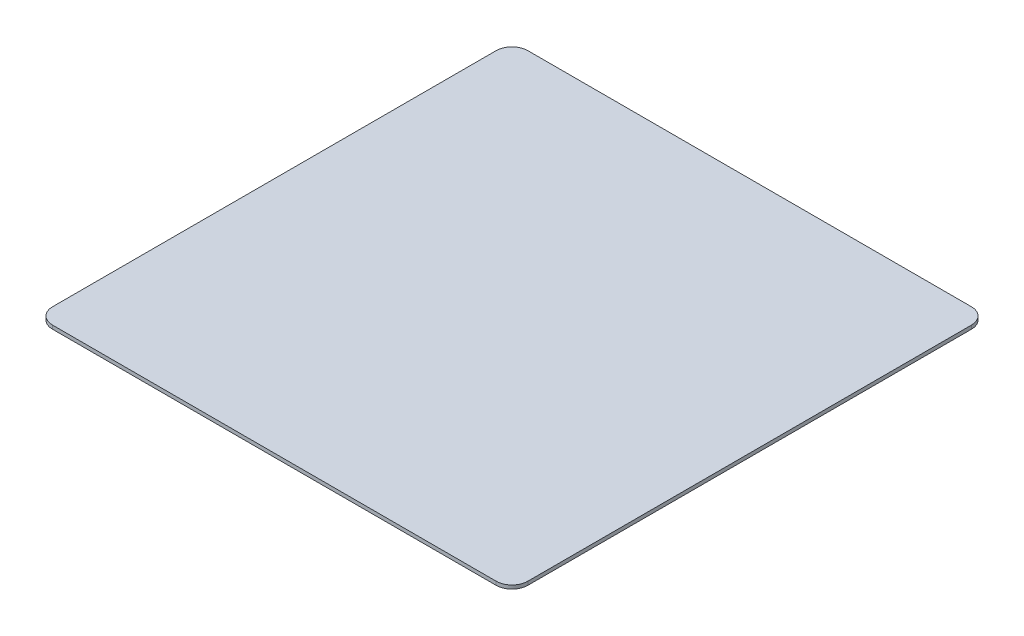
ISO-10303-21;
HEADER;
FILE_DESCRIPTION(('STEP AP214'),'2;1');
FILE_NAME('part.step','',(''),(''),'','','');
FILE_SCHEMA(('AUTOMOTIVE_DESIGN { 1 0 10303 214 1 1 1 1 }'));
ENDSEC;
DATA;
#1=APPLICATION_CONTEXT('core data for automotive mechanical design processes');
#2=APPLICATION_PROTOCOL_DEFINITION('international standard','automotive_design',2000,#1);
#3=PRODUCT_CONTEXT('',#1,'mechanical');
#4=PRODUCT('Part','Part','',(#3));
#5=PRODUCT_RELATED_PRODUCT_CATEGORY('part','',(#4));
#6=PRODUCT_DEFINITION_FORMATION('','',#4);
#7=PRODUCT_DEFINITION_CONTEXT('part definition',#1,'design');
#8=PRODUCT_DEFINITION('design','',#6,#7);
#9=PRODUCT_DEFINITION_SHAPE('','',#8);
#10=(LENGTH_UNIT() NAMED_UNIT(*) SI_UNIT(.MILLI.,.METRE.));
#11=(NAMED_UNIT(*) PLANE_ANGLE_UNIT() SI_UNIT($,.RADIAN.));
#12=(NAMED_UNIT(*) SI_UNIT($,.STERADIAN.) SOLID_ANGLE_UNIT());
#13=UNCERTAINTY_MEASURE_WITH_UNIT(LENGTH_MEASURE(1.E-05),#10,'distance_accuracy_value','');
#14=(GEOMETRIC_REPRESENTATION_CONTEXT(3) GLOBAL_UNCERTAINTY_ASSIGNED_CONTEXT((#13)) GLOBAL_UNIT_ASSIGNED_CONTEXT((#10,
#11,#12)) REPRESENTATION_CONTEXT('',''));
#15=CARTESIAN_POINT('',(0.,0.,0.));
#16=DIRECTION('',(0.,0.,1.));
#17=DIRECTION('',(1.,0.,0.));
#18=AXIS2_PLACEMENT_3D('',#15,#16,#17);
#19=CARTESIAN_POINT('',(-150.,2.286,150.));
#20=DIRECTION('',(1.,0.,0.));
#21=DIRECTION('',(0.,0.,-1.));
#22=AXIS2_PLACEMENT_3D('',#19,#20,#21);
#23=PLANE('',#22);
#24=DIRECTION('',(0.,0.,1.));
#25=VECTOR('',#24,1.);
#26=CARTESIAN_POINT('',(-150.,2.286,150.));
#27=LINE('',#26,#25);
#28=CARTESIAN_POINT('',(-150.,2.286,-140.));
#29=VERTEX_POINT('',#28);
#30=CARTESIAN_POINT('',(-150.,2.286,140.));
#31=VERTEX_POINT('',#30);
#32=EDGE_CURVE('E128',#29,#31,#27,.T.);
#33=ORIENTED_EDGE('',*,*,#32,.F.);
#34=DIRECTION('',(0.,-1.,0.));
#35=VECTOR('',#34,1.);
#36=CARTESIAN_POINT('',(-150.,2.286,-140.));
#37=LINE('',#36,#35);
#38=CARTESIAN_POINT('',(-150.,0.,-140.));
#39=VERTEX_POINT('',#38);
#40=EDGE_CURVE('E11',#29,#39,#37,.T.);
#41=ORIENTED_EDGE('',*,*,#40,.T.);
#42=DIRECTION('',(0.,0.,1.));
#43=VECTOR('',#42,1.);
#44=CARTESIAN_POINT('',(-150.,0.,150.));
#45=LINE('',#44,#43);
#46=CARTESIAN_POINT('',(-150.,0.,140.));
#47=VERTEX_POINT('',#46);
#48=EDGE_CURVE('E159',#39,#47,#45,.T.);
#49=ORIENTED_EDGE('',*,*,#48,.T.);
#50=DIRECTION('',(0.,-1.,0.));
#51=VECTOR('',#50,1.);
#52=CARTESIAN_POINT('',(-150.,2.286,140.));
#53=LINE('',#52,#51);
#54=EDGE_CURVE('E42',#47,#31,#53,.F.);
#55=ORIENTED_EDGE('',*,*,#54,.T.);
#56=EDGE_LOOP('',(#33,#41,#49,#55));
#57=FACE_BOUND('',#56,.T.);
#58=ADVANCED_FACE('F34',(#57),#23,.F.);
#59=CARTESIAN_POINT('',(150.,2.286,150.));
#60=DIRECTION('',(0.,0.,-1.));
#61=DIRECTION('',(-1.,0.,0.));
#62=AXIS2_PLACEMENT_3D('',#59,#60,#61);
#63=PLANE('',#62);
#64=DIRECTION('',(1.,0.,0.));
#65=VECTOR('',#64,1.);
#66=CARTESIAN_POINT('',(150.,0.,150.));
#67=LINE('',#66,#65);
#68=CARTESIAN_POINT('',(-140.,0.,150.));
#69=VERTEX_POINT('',#68);
#70=CARTESIAN_POINT('',(140.,0.,150.));
#71=VERTEX_POINT('',#70);
#72=EDGE_CURVE('E133',#69,#71,#67,.T.);
#73=ORIENTED_EDGE('',*,*,#72,.T.);
#74=DIRECTION('',(0.,-1.,0.));
#75=VECTOR('',#74,1.);
#76=CARTESIAN_POINT('',(140.,2.286,150.));
#77=LINE('',#76,#75);
#78=CARTESIAN_POINT('',(140.,2.286,150.));
#79=VERTEX_POINT('',#78);
#80=EDGE_CURVE('E49',#71,#79,#77,.F.);
#81=ORIENTED_EDGE('',*,*,#80,.T.);
#82=DIRECTION('',(1.,0.,0.));
#83=VECTOR('',#82,1.);
#84=CARTESIAN_POINT('',(150.,2.286,150.));
#85=LINE('',#84,#83);
#86=CARTESIAN_POINT('',(-140.,2.286,150.));
#87=VERTEX_POINT('',#86);
#88=EDGE_CURVE('E131',#87,#79,#85,.T.);
#89=ORIENTED_EDGE('',*,*,#88,.F.);
#90=DIRECTION('',(0.,-1.,0.));
#91=VECTOR('',#90,1.);
#92=CARTESIAN_POINT('',(-140.,2.286,150.));
#93=LINE('',#92,#91);
#94=EDGE_CURVE('E151',#87,#69,#93,.T.);
#95=ORIENTED_EDGE('',*,*,#94,.T.);
#96=EDGE_LOOP('',(#73,#81,#89,#95));
#97=FACE_BOUND('',#96,.T.);
#98=ADVANCED_FACE('F166',(#97),#63,.F.);
#99=CARTESIAN_POINT('',(150.,2.286,150.));
#100=DIRECTION('',(-1.,0.,0.));
#101=DIRECTION('',(0.,0.,1.));
#102=AXIS2_PLACEMENT_3D('',#99,#100,#101);
#103=PLANE('',#102);
#104=DIRECTION('',(0.,0.,-1.));
#105=VECTOR('',#104,1.);
#106=CARTESIAN_POINT('',(150.,0.,150.));
#107=LINE('',#106,#105);
#108=CARTESIAN_POINT('',(150.,0.,140.));
#109=VERTEX_POINT('',#108);
#110=CARTESIAN_POINT('',(150.,0.,-140.));
#111=VERTEX_POINT('',#110);
#112=EDGE_CURVE('E129',#109,#111,#107,.T.);
#113=ORIENTED_EDGE('',*,*,#112,.T.);
#114=DIRECTION('',(0.,-1.,0.));
#115=VECTOR('',#114,1.);
#116=CARTESIAN_POINT('',(150.,2.286,-140.));
#117=LINE('',#116,#115);
#118=CARTESIAN_POINT('',(150.,2.286,-140.));
#119=VERTEX_POINT('',#118);
#120=EDGE_CURVE('E106',#111,#119,#117,.F.);
#121=ORIENTED_EDGE('',*,*,#120,.T.);
#122=DIRECTION('',(0.,0.,-1.));
#123=VECTOR('',#122,1.);
#124=CARTESIAN_POINT('',(150.,2.286,150.));
#125=LINE('',#124,#123);
#126=CARTESIAN_POINT('',(150.,2.286,140.));
#127=VERTEX_POINT('',#126);
#128=EDGE_CURVE('E170',#127,#119,#125,.T.);
#129=ORIENTED_EDGE('',*,*,#128,.F.);
#130=DIRECTION('',(0.,-1.,0.));
#131=VECTOR('',#130,1.);
#132=CARTESIAN_POINT('',(150.,2.286,140.));
#133=LINE('',#132,#131);
#134=EDGE_CURVE('E111',#127,#109,#133,.T.);
#135=ORIENTED_EDGE('',*,*,#134,.T.);
#136=EDGE_LOOP('',(#113,#121,#129,#135));
#137=FACE_BOUND('',#136,.T.);
#138=ADVANCED_FACE('F178',(#137),#103,.F.);
#139=CARTESIAN_POINT('',(150.,2.286,-150.));
#140=DIRECTION('',(0.,0.,1.));
#141=DIRECTION('',(1.,0.,0.));
#142=AXIS2_PLACEMENT_3D('',#139,#140,#141);
#143=PLANE('',#142);
#144=DIRECTION('',(-1.,0.,0.));
#145=VECTOR('',#144,1.);
#146=CARTESIAN_POINT('',(150.,2.286,-150.));
#147=LINE('',#146,#145);
#148=CARTESIAN_POINT('',(140.,2.286,-150.));
#149=VERTEX_POINT('',#148);
#150=CARTESIAN_POINT('',(-140.,2.286,-150.));
#151=VERTEX_POINT('',#150);
#152=EDGE_CURVE('E121',#149,#151,#147,.T.);
#153=ORIENTED_EDGE('',*,*,#152,.F.);
#154=DIRECTION('',(0.,-1.,0.));
#155=VECTOR('',#154,1.);
#156=CARTESIAN_POINT('',(140.,2.286,-150.));
#157=LINE('',#156,#155);
#158=CARTESIAN_POINT('',(140.,0.,-150.));
#159=VERTEX_POINT('',#158);
#160=EDGE_CURVE('E105',#149,#159,#157,.T.);
#161=ORIENTED_EDGE('',*,*,#160,.T.);
#162=DIRECTION('',(-1.,0.,0.));
#163=VECTOR('',#162,1.);
#164=CARTESIAN_POINT('',(150.,0.,-150.));
#165=LINE('',#164,#163);
#166=CARTESIAN_POINT('',(-140.,0.,-150.));
#167=VERTEX_POINT('',#166);
#168=EDGE_CURVE('E118',#159,#167,#165,.T.);
#169=ORIENTED_EDGE('',*,*,#168,.T.);
#170=DIRECTION('',(0.,-1.,0.));
#171=VECTOR('',#170,1.);
#172=CARTESIAN_POINT('',(-140.,2.286,-150.));
#173=LINE('',#172,#171);
#174=EDGE_CURVE('E123',#167,#151,#173,.F.);
#175=ORIENTED_EDGE('',*,*,#174,.T.);
#176=EDGE_LOOP('',(#153,#161,#169,#175));
#177=FACE_BOUND('',#176,.T.);
#178=ADVANCED_FACE('F117',(#177),#143,.F.);
#179=CARTESIAN_POINT('',(0.,2.286,0.));
#180=DIRECTION('',(0.,1.,0.));
#181=DIRECTION('',(0.,0.,1.));
#182=AXIS2_PLACEMENT_3D('',#179,#180,#181);
#183=PLANE('',#182);
#184=ORIENTED_EDGE('',*,*,#128,.T.);
#185=CARTESIAN_POINT('',(140.,2.286,-140.));
#186=DIRECTION('',(0.,1.,0.));
#187=DIRECTION('',(0.,0.,1.));
#188=AXIS2_PLACEMENT_3D('',#185,#186,#187);
#189=CIRCLE('',#188,10.);
#190=EDGE_CURVE('E149',#119,#149,#189,.T.);
#191=ORIENTED_EDGE('',*,*,#190,.T.);
#192=ORIENTED_EDGE('',*,*,#152,.T.);
#193=CARTESIAN_POINT('',(-140.,2.286,-140.));
#194=DIRECTION('',(0.,1.,0.));
#195=DIRECTION('',(0.,0.,1.));
#196=AXIS2_PLACEMENT_3D('',#193,#194,#195);
#197=CIRCLE('',#196,10.);
#198=EDGE_CURVE('E145',#151,#29,#197,.T.);
#199=ORIENTED_EDGE('',*,*,#198,.T.);
#200=ORIENTED_EDGE('',*,*,#32,.T.);
#201=CARTESIAN_POINT('',(-140.,2.286,140.));
#202=DIRECTION('',(0.,1.,0.));
#203=DIRECTION('',(0.,0.,1.));
#204=AXIS2_PLACEMENT_3D('',#201,#202,#203);
#205=CIRCLE('',#204,10.);
#206=EDGE_CURVE('E56',#31,#87,#205,.T.);
#207=ORIENTED_EDGE('',*,*,#206,.T.);
#208=ORIENTED_EDGE('',*,*,#88,.T.);
#209=CARTESIAN_POINT('',(140.,2.286,140.));
#210=DIRECTION('',(0.,1.,0.));
#211=DIRECTION('',(0.,0.,1.));
#212=AXIS2_PLACEMENT_3D('',#209,#210,#211);
#213=CIRCLE('',#212,10.);
#214=EDGE_CURVE('E147',#79,#127,#213,.T.);
#215=ORIENTED_EDGE('',*,*,#214,.T.);
#216=EDGE_LOOP('',(#184,#191,#192,#199,#200,#207,#208,#215));
#217=FACE_BOUND('',#216,.T.);
#218=ADVANCED_FACE('F162',(#217),#183,.T.);
#219=CARTESIAN_POINT('',(0.,0.,0.));
#220=DIRECTION('',(0.,1.,0.));
#221=DIRECTION('',(0.,0.,1.));
#222=AXIS2_PLACEMENT_3D('',#219,#220,#221);
#223=PLANE('',#222);
#224=ORIENTED_EDGE('',*,*,#168,.F.);
#225=CARTESIAN_POINT('',(140.,0.,-140.));
#226=DIRECTION('',(0.,1.,0.));
#227=DIRECTION('',(0.,0.,1.));
#228=AXIS2_PLACEMENT_3D('',#225,#226,#227);
#229=CIRCLE('',#228,10.);
#230=EDGE_CURVE('E101',#159,#111,#229,.F.);
#231=ORIENTED_EDGE('',*,*,#230,.T.);
#232=ORIENTED_EDGE('',*,*,#112,.F.);
#233=CARTESIAN_POINT('',(140.,0.,140.));
#234=DIRECTION('',(0.,1.,0.));
#235=DIRECTION('',(0.,0.,1.));
#236=AXIS2_PLACEMENT_3D('',#233,#234,#235);
#237=CIRCLE('',#236,10.);
#238=EDGE_CURVE('E112',#109,#71,#237,.F.);
#239=ORIENTED_EDGE('',*,*,#238,.T.);
#240=ORIENTED_EDGE('',*,*,#72,.F.);
#241=CARTESIAN_POINT('',(-140.,0.,140.));
#242=DIRECTION('',(0.,1.,0.));
#243=DIRECTION('',(0.,0.,1.));
#244=AXIS2_PLACEMENT_3D('',#241,#242,#243);
#245=CIRCLE('',#244,10.);
#246=EDGE_CURVE('E122',#69,#47,#245,.F.);
#247=ORIENTED_EDGE('',*,*,#246,.T.);
#248=ORIENTED_EDGE('',*,*,#48,.F.);
#249=CARTESIAN_POINT('',(-140.,0.,-140.));
#250=DIRECTION('',(0.,1.,0.));
#251=DIRECTION('',(0.,0.,1.));
#252=AXIS2_PLACEMENT_3D('',#249,#250,#251);
#253=CIRCLE('',#252,10.);
#254=EDGE_CURVE('E127',#39,#167,#253,.F.);
#255=ORIENTED_EDGE('',*,*,#254,.T.);
#256=EDGE_LOOP('',(#224,#231,#232,#239,#240,#247,#248,#255));
#257=FACE_BOUND('',#256,.T.);
#258=ADVANCED_FACE('F125',(#257),#223,.F.);
#259=CARTESIAN_POINT('',(140.,2.286,-140.));
#260=DIRECTION('',(0.,-1.,0.));
#261=DIRECTION('',(0.,0.,-1.));
#262=AXIS2_PLACEMENT_3D('',#259,#260,#261);
#263=CYLINDRICAL_SURFACE('',#262,10.);
#264=ORIENTED_EDGE('',*,*,#190,.F.);
#265=ORIENTED_EDGE('',*,*,#120,.F.);
#266=ORIENTED_EDGE('',*,*,#230,.F.);
#267=ORIENTED_EDGE('',*,*,#160,.F.);
#268=EDGE_LOOP('',(#264,#265,#266,#267));
#269=FACE_BOUND('',#268,.T.);
#270=ADVANCED_FACE('F104',(#269),#263,.T.);
#271=CARTESIAN_POINT('',(140.,2.286,140.));
#272=DIRECTION('',(0.,-1.,0.));
#273=DIRECTION('',(0.,0.,-1.));
#274=AXIS2_PLACEMENT_3D('',#271,#272,#273);
#275=CYLINDRICAL_SURFACE('',#274,10.);
#276=ORIENTED_EDGE('',*,*,#214,.F.);
#277=ORIENTED_EDGE('',*,*,#80,.F.);
#278=ORIENTED_EDGE('',*,*,#238,.F.);
#279=ORIENTED_EDGE('',*,*,#134,.F.);
#280=EDGE_LOOP('',(#276,#277,#278,#279));
#281=FACE_BOUND('',#280,.T.);
#282=ADVANCED_FACE('F176',(#281),#275,.T.);
#283=CARTESIAN_POINT('',(-140.,2.286,-140.));
#284=DIRECTION('',(0.,-1.,0.));
#285=DIRECTION('',(0.,0.,-1.));
#286=AXIS2_PLACEMENT_3D('',#283,#284,#285);
#287=CYLINDRICAL_SURFACE('',#286,10.);
#288=ORIENTED_EDGE('',*,*,#198,.F.);
#289=ORIENTED_EDGE('',*,*,#174,.F.);
#290=ORIENTED_EDGE('',*,*,#254,.F.);
#291=ORIENTED_EDGE('',*,*,#40,.F.);
#292=EDGE_LOOP('',(#288,#289,#290,#291));
#293=FACE_BOUND('',#292,.T.);
#294=ADVANCED_FACE('F180',(#293),#287,.T.);
#295=CARTESIAN_POINT('',(-140.,2.286,140.));
#296=DIRECTION('',(0.,-1.,0.));
#297=DIRECTION('',(0.,0.,-1.));
#298=AXIS2_PLACEMENT_3D('',#295,#296,#297);
#299=CYLINDRICAL_SURFACE('',#298,10.);
#300=ORIENTED_EDGE('',*,*,#206,.F.);
#301=ORIENTED_EDGE('',*,*,#54,.F.);
#302=ORIENTED_EDGE('',*,*,#246,.F.);
#303=ORIENTED_EDGE('',*,*,#94,.F.);
#304=EDGE_LOOP('',(#300,#301,#302,#303));
#305=FACE_BOUND('',#304,.T.);
#306=ADVANCED_FACE('F36',(#305),#299,.T.);
#307=CLOSED_SHELL('',(#58,#98,#138,#178,#218,#258,#270,#282,#294,#306));
#308=MANIFOLD_SOLID_BREP('B2',#307);
#309=ADVANCED_BREP_SHAPE_REPRESENTATION('',(#18,#308),#14);
#310=SHAPE_DEFINITION_REPRESENTATION(#9,#309);
ENDSEC;
END-ISO-10303-21;
